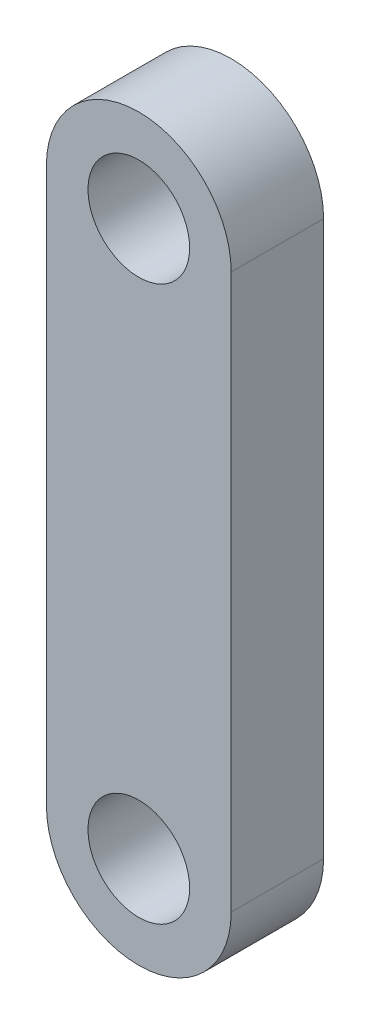
ISO-10303-21;
HEADER;
FILE_DESCRIPTION(('STEP AP214'),'2;1');
FILE_NAME('part.step','',(''),(''),'','','');
FILE_SCHEMA(('AUTOMOTIVE_DESIGN { 1 0 10303 214 1 1 1 1 }'));
ENDSEC;
DATA;
#1=APPLICATION_CONTEXT('core data for automotive mechanical design processes');
#2=APPLICATION_PROTOCOL_DEFINITION('international standard','automotive_design',2000,#1);
#3=PRODUCT_CONTEXT('',#1,'mechanical');
#4=PRODUCT('Part','Part','',(#3));
#5=PRODUCT_RELATED_PRODUCT_CATEGORY('part','',(#4));
#6=PRODUCT_DEFINITION_FORMATION('','',#4);
#7=PRODUCT_DEFINITION_CONTEXT('part definition',#1,'design');
#8=PRODUCT_DEFINITION('design','',#6,#7);
#9=PRODUCT_DEFINITION_SHAPE('','',#8);
#10=(LENGTH_UNIT() NAMED_UNIT(*) SI_UNIT(.MILLI.,.METRE.));
#11=(NAMED_UNIT(*) PLANE_ANGLE_UNIT() SI_UNIT($,.RADIAN.));
#12=(NAMED_UNIT(*) SI_UNIT($,.STERADIAN.) SOLID_ANGLE_UNIT());
#13=UNCERTAINTY_MEASURE_WITH_UNIT(LENGTH_MEASURE(1.E-05),#10,'distance_accuracy_value','');
#14=(GEOMETRIC_REPRESENTATION_CONTEXT(3) GLOBAL_UNCERTAINTY_ASSIGNED_CONTEXT((#13)) GLOBAL_UNIT_ASSIGNED_CONTEXT((#10,
#11,#12)) REPRESENTATION_CONTEXT('',''));
#15=CARTESIAN_POINT('',(0.,0.,0.));
#16=DIRECTION('',(0.,0.,1.));
#17=DIRECTION('',(1.,0.,0.));
#18=AXIS2_PLACEMENT_3D('',#15,#16,#17);
#19=CARTESIAN_POINT('',(0.,7.62,2.54));
#20=DIRECTION('',(0.,0.,-1.));
#21=DIRECTION('',(-1.,0.,0.));
#22=AXIS2_PLACEMENT_3D('',#19,#20,#21);
#23=PLANE('',#22);
#24=CARTESIAN_POINT('',(0.,7.62,2.54));
#25=DIRECTION('',(0.,0.,1.));
#26=DIRECTION('',(-1.,0.,0.));
#27=AXIS2_PLACEMENT_3D('',#24,#25,#26);
#28=CIRCLE('',#27,2.54);
#29=CARTESIAN_POINT('',(2.54,7.62,2.54));
#30=VERTEX_POINT('',#29);
#31=CARTESIAN_POINT('',(-2.54,7.62,2.54));
#32=VERTEX_POINT('',#31);
#33=EDGE_CURVE('E91',#30,#32,#28,.T.);
#34=ORIENTED_EDGE('',*,*,#33,.T.);
#35=DIRECTION('',(0.,-1.,0.));
#36=VECTOR('',#35,1.);
#37=CARTESIAN_POINT('',(-2.54,-7.62,2.54));
#38=LINE('',#37,#36);
#39=CARTESIAN_POINT('',(-2.54,-7.62,2.54));
#40=VERTEX_POINT('',#39);
#41=EDGE_CURVE('E86',#32,#40,#38,.T.);
#42=ORIENTED_EDGE('',*,*,#41,.T.);
#43=CARTESIAN_POINT('',(0.,-7.62,2.54));
#44=DIRECTION('',(0.,0.,1.));
#45=DIRECTION('',(1.,0.,0.));
#46=AXIS2_PLACEMENT_3D('',#43,#44,#45);
#47=CIRCLE('',#46,2.54);
#48=CARTESIAN_POINT('',(2.54,-7.62,2.54));
#49=VERTEX_POINT('',#48);
#50=EDGE_CURVE('E89',#40,#49,#47,.T.);
#51=ORIENTED_EDGE('',*,*,#50,.T.);
#52=DIRECTION('',(0.,1.,0.));
#53=VECTOR('',#52,1.);
#54=CARTESIAN_POINT('',(2.54,-7.62,2.54));
#55=LINE('',#54,#53);
#56=EDGE_CURVE('E56',#49,#30,#55,.T.);
#57=ORIENTED_EDGE('',*,*,#56,.T.);
#58=EDGE_LOOP('',(#34,#42,#51,#57));
#59=FACE_BOUND('',#58,.T.);
#60=CARTESIAN_POINT('',(0.,-7.62,2.54));
#61=DIRECTION('',(0.,0.,1.));
#62=DIRECTION('',(1.,0.,0.));
#63=AXIS2_PLACEMENT_3D('',#60,#61,#62);
#64=CIRCLE('',#63,1.397);
#65=CARTESIAN_POINT('',(1.397,-7.62,2.54));
#66=VERTEX_POINT('',#65);
#67=EDGE_CURVE('E106',#66,#66,#64,.T.);
#68=ORIENTED_EDGE('',*,*,#67,.F.);
#69=EDGE_LOOP('',(#68));
#70=FACE_BOUND('',#69,.T.);
#71=CARTESIAN_POINT('',(0.,7.62,2.54));
#72=DIRECTION('',(0.,0.,1.));
#73=DIRECTION('',(1.,0.,0.));
#74=AXIS2_PLACEMENT_3D('',#71,#72,#73);
#75=CIRCLE('',#74,1.397);
#76=CARTESIAN_POINT('',(1.397,7.62,2.54));
#77=VERTEX_POINT('',#76);
#78=EDGE_CURVE('E121',#77,#77,#75,.T.);
#79=ORIENTED_EDGE('',*,*,#78,.F.);
#80=EDGE_LOOP('',(#79));
#81=FACE_BOUND('',#80,.T.);
#82=ADVANCED_FACE('F39',(#59,#70,#81),#23,.F.);
#83=CARTESIAN_POINT('',(0.,7.62,0.));
#84=DIRECTION('',(0.,0.,-1.));
#85=DIRECTION('',(-1.,0.,0.));
#86=AXIS2_PLACEMENT_3D('',#83,#84,#85);
#87=PLANE('',#86);
#88=CARTESIAN_POINT('',(0.,-7.62,0.));
#89=DIRECTION('',(0.,0.,1.));
#90=DIRECTION('',(1.,0.,0.));
#91=AXIS2_PLACEMENT_3D('',#88,#89,#90);
#92=CIRCLE('',#91,1.397);
#93=CARTESIAN_POINT('',(1.397,-7.62,0.));
#94=VERTEX_POINT('',#93);
#95=EDGE_CURVE('E118',#94,#94,#92,.T.);
#96=ORIENTED_EDGE('',*,*,#95,.T.);
#97=EDGE_LOOP('',(#96));
#98=FACE_BOUND('',#97,.T.);
#99=CARTESIAN_POINT('',(0.,7.62,0.));
#100=DIRECTION('',(0.,0.,1.));
#101=DIRECTION('',(-1.,0.,0.));
#102=AXIS2_PLACEMENT_3D('',#99,#100,#101);
#103=CIRCLE('',#102,2.54);
#104=CARTESIAN_POINT('',(2.54,7.62,0.));
#105=VERTEX_POINT('',#104);
#106=CARTESIAN_POINT('',(-2.54,7.62,0.));
#107=VERTEX_POINT('',#106);
#108=EDGE_CURVE('E103',#105,#107,#103,.T.);
#109=ORIENTED_EDGE('',*,*,#108,.F.);
#110=DIRECTION('',(0.,1.,0.));
#111=VECTOR('',#110,1.);
#112=CARTESIAN_POINT('',(2.54,-7.62,0.));
#113=LINE('',#112,#111);
#114=CARTESIAN_POINT('',(2.54,-7.62,0.));
#115=VERTEX_POINT('',#114);
#116=EDGE_CURVE('E79',#115,#105,#113,.T.);
#117=ORIENTED_EDGE('',*,*,#116,.F.);
#118=CARTESIAN_POINT('',(0.,-7.62,0.));
#119=DIRECTION('',(0.,0.,1.));
#120=DIRECTION('',(1.,0.,0.));
#121=AXIS2_PLACEMENT_3D('',#118,#119,#120);
#122=CIRCLE('',#121,2.54);
#123=CARTESIAN_POINT('',(-2.54,-7.62,0.));
#124=VERTEX_POINT('',#123);
#125=EDGE_CURVE('E73',#124,#115,#122,.T.);
#126=ORIENTED_EDGE('',*,*,#125,.F.);
#127=DIRECTION('',(0.,-1.,0.));
#128=VECTOR('',#127,1.);
#129=CARTESIAN_POINT('',(-2.54,-7.62,0.));
#130=LINE('',#129,#128);
#131=EDGE_CURVE('E95',#107,#124,#130,.T.);
#132=ORIENTED_EDGE('',*,*,#131,.F.);
#133=EDGE_LOOP('',(#109,#117,#126,#132));
#134=FACE_BOUND('',#133,.T.);
#135=CARTESIAN_POINT('',(0.,7.62,0.));
#136=DIRECTION('',(0.,0.,1.));
#137=DIRECTION('',(1.,0.,0.));
#138=AXIS2_PLACEMENT_3D('',#135,#136,#137);
#139=CIRCLE('',#138,1.397);
#140=CARTESIAN_POINT('',(1.397,7.62,0.));
#141=VERTEX_POINT('',#140);
#142=EDGE_CURVE('E124',#141,#141,#139,.T.);
#143=ORIENTED_EDGE('',*,*,#142,.T.);
#144=EDGE_LOOP('',(#143));
#145=FACE_BOUND('',#144,.T.);
#146=ADVANCED_FACE('F114',(#98,#134,#145),#87,.T.);
#147=CARTESIAN_POINT('',(0.,7.62,2.54));
#148=DIRECTION('',(0.,0.,-1.));
#149=DIRECTION('',(-1.,0.,0.));
#150=AXIS2_PLACEMENT_3D('',#147,#148,#149);
#151=CYLINDRICAL_SURFACE('',#150,2.54);
#152=ORIENTED_EDGE('',*,*,#108,.T.);
#153=DIRECTION('',(0.,0.,-1.));
#154=VECTOR('',#153,1.);
#155=CARTESIAN_POINT('',(-2.54,7.62,2.54));
#156=LINE('',#155,#154);
#157=EDGE_CURVE('E11',#32,#107,#156,.T.);
#158=ORIENTED_EDGE('',*,*,#157,.F.);
#159=ORIENTED_EDGE('',*,*,#33,.F.);
#160=DIRECTION('',(0.,0.,-1.));
#161=VECTOR('',#160,1.);
#162=CARTESIAN_POINT('',(2.54,7.62,2.54));
#163=LINE('',#162,#161);
#164=EDGE_CURVE('E99',#30,#105,#163,.T.);
#165=ORIENTED_EDGE('',*,*,#164,.T.);
#166=EDGE_LOOP('',(#152,#158,#159,#165));
#167=FACE_BOUND('',#166,.T.);
#168=ADVANCED_FACE('F41',(#167),#151,.T.);
#169=CARTESIAN_POINT('',(-2.54,-7.62,2.54));
#170=DIRECTION('',(1.,0.,0.));
#171=DIRECTION('',(0.,0.,-1.));
#172=AXIS2_PLACEMENT_3D('',#169,#170,#171);
#173=PLANE('',#172);
#174=ORIENTED_EDGE('',*,*,#131,.T.);
#175=DIRECTION('',(0.,0.,-1.));
#176=VECTOR('',#175,1.);
#177=CARTESIAN_POINT('',(-2.54,-7.62,2.54));
#178=LINE('',#177,#176);
#179=EDGE_CURVE('E48',#40,#124,#178,.T.);
#180=ORIENTED_EDGE('',*,*,#179,.F.);
#181=ORIENTED_EDGE('',*,*,#41,.F.);
#182=ORIENTED_EDGE('',*,*,#157,.T.);
#183=EDGE_LOOP('',(#174,#180,#181,#182));
#184=FACE_BOUND('',#183,.T.);
#185=ADVANCED_FACE('F94',(#184),#173,.F.);
#186=CARTESIAN_POINT('',(0.,-7.62,2.54));
#187=DIRECTION('',(0.,0.,-1.));
#188=DIRECTION('',(-1.,0.,0.));
#189=AXIS2_PLACEMENT_3D('',#186,#187,#188);
#190=CYLINDRICAL_SURFACE('',#189,2.54);
#191=ORIENTED_EDGE('',*,*,#125,.T.);
#192=DIRECTION('',(0.,0.,-1.));
#193=VECTOR('',#192,1.);
#194=CARTESIAN_POINT('',(2.54,-7.62,2.54));
#195=LINE('',#194,#193);
#196=EDGE_CURVE('E96',#49,#115,#195,.T.);
#197=ORIENTED_EDGE('',*,*,#196,.F.);
#198=ORIENTED_EDGE('',*,*,#50,.F.);
#199=ORIENTED_EDGE('',*,*,#179,.T.);
#200=EDGE_LOOP('',(#191,#197,#198,#199));
#201=FACE_BOUND('',#200,.T.);
#202=ADVANCED_FACE('F97',(#201),#190,.T.);
#203=CARTESIAN_POINT('',(2.54,-7.62,2.54));
#204=DIRECTION('',(-1.,0.,0.));
#205=DIRECTION('',(0.,0.,1.));
#206=AXIS2_PLACEMENT_3D('',#203,#204,#205);
#207=PLANE('',#206);
#208=ORIENTED_EDGE('',*,*,#116,.T.);
#209=ORIENTED_EDGE('',*,*,#164,.F.);
#210=ORIENTED_EDGE('',*,*,#56,.F.);
#211=ORIENTED_EDGE('',*,*,#196,.T.);
#212=EDGE_LOOP('',(#208,#209,#210,#211));
#213=FACE_BOUND('',#212,.T.);
#214=ADVANCED_FACE('F111',(#213),#207,.F.);
#215=CARTESIAN_POINT('',(0.,-7.62,2.54));
#216=DIRECTION('',(0.,0.,-1.));
#217=DIRECTION('',(-1.,0.,0.));
#218=AXIS2_PLACEMENT_3D('',#215,#216,#217);
#219=CYLINDRICAL_SURFACE('',#218,1.397);
#220=ORIENTED_EDGE('',*,*,#67,.T.);
#221=EDGE_LOOP('',(#220));
#222=FACE_BOUND('',#221,.T.);
#223=ORIENTED_EDGE('',*,*,#95,.F.);
#224=EDGE_LOOP('',(#223));
#225=FACE_BOUND('',#224,.T.);
#226=ADVANCED_FACE('F141',(#222,#225),#219,.F.);
#227=CARTESIAN_POINT('',(0.,7.62,2.54));
#228=DIRECTION('',(0.,0.,-1.));
#229=DIRECTION('',(-1.,0.,0.));
#230=AXIS2_PLACEMENT_3D('',#227,#228,#229);
#231=CYLINDRICAL_SURFACE('',#230,1.397);
#232=ORIENTED_EDGE('',*,*,#78,.T.);
#233=EDGE_LOOP('',(#232));
#234=FACE_BOUND('',#233,.T.);
#235=ORIENTED_EDGE('',*,*,#142,.F.);
#236=EDGE_LOOP('',(#235));
#237=FACE_BOUND('',#236,.T.);
#238=ADVANCED_FACE('F130',(#234,#237),#231,.F.);
#239=CLOSED_SHELL('',(#82,#146,#168,#185,#202,#214,#226,#238));
#240=MANIFOLD_SOLID_BREP('B2',#239);
#241=ADVANCED_BREP_SHAPE_REPRESENTATION('',(#18,#240),#14);
#242=SHAPE_DEFINITION_REPRESENTATION(#9,#241);
ENDSEC;
END-ISO-10303-21;
